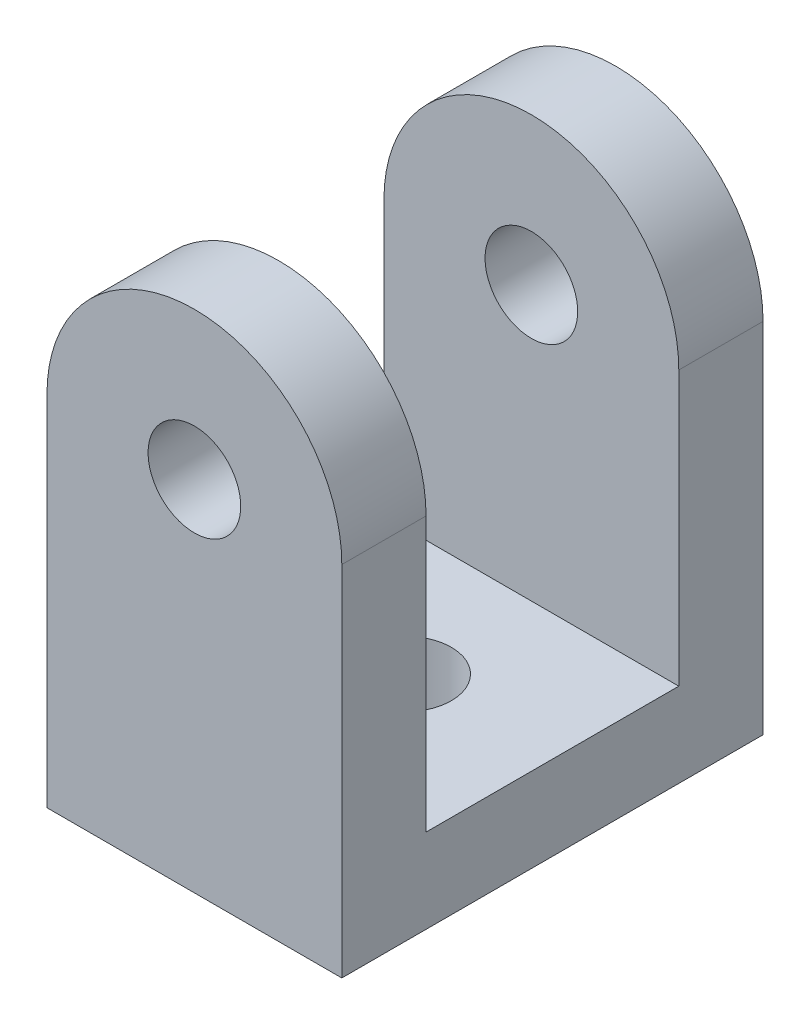
ISO-10303-21;
HEADER;
FILE_DESCRIPTION(('STEP AP214'),'2;1');
FILE_NAME('part.step','',(''),(''),'','','');
FILE_SCHEMA(('AUTOMOTIVE_DESIGN { 1 0 10303 214 1 1 1 1 }'));
ENDSEC;
DATA;
#1=APPLICATION_CONTEXT('core data for automotive mechanical design processes');
#2=APPLICATION_PROTOCOL_DEFINITION('international standard','automotive_design',2000,#1);
#3=PRODUCT_CONTEXT('',#1,'mechanical');
#4=PRODUCT('Part','Part','',(#3));
#5=PRODUCT_RELATED_PRODUCT_CATEGORY('part','',(#4));
#6=PRODUCT_DEFINITION_FORMATION('','',#4);
#7=PRODUCT_DEFINITION_CONTEXT('part definition',#1,'design');
#8=PRODUCT_DEFINITION('design','',#6,#7);
#9=PRODUCT_DEFINITION_SHAPE('','',#8);
#10=(LENGTH_UNIT() NAMED_UNIT(*) SI_UNIT(.MILLI.,.METRE.));
#11=(NAMED_UNIT(*) PLANE_ANGLE_UNIT() SI_UNIT($,.RADIAN.));
#12=(NAMED_UNIT(*) SI_UNIT($,.STERADIAN.) SOLID_ANGLE_UNIT());
#13=UNCERTAINTY_MEASURE_WITH_UNIT(LENGTH_MEASURE(1.E-05),#10,'distance_accuracy_value','');
#14=(GEOMETRIC_REPRESENTATION_CONTEXT(3) GLOBAL_UNCERTAINTY_ASSIGNED_CONTEXT((#13)) GLOBAL_UNIT_ASSIGNED_CONTEXT((#10,
#11,#12)) REPRESENTATION_CONTEXT('',''));
#15=CARTESIAN_POINT('',(0.,0.,0.));
#16=DIRECTION('',(0.,0.,1.));
#17=DIRECTION('',(1.,0.,0.));
#18=AXIS2_PLACEMENT_3D('',#15,#16,#17);
#19=CARTESIAN_POINT('',(0.,8.5,-5.));
#20=DIRECTION('',(0.,0.,-1.));
#21=DIRECTION('',(-1.,0.,0.));
#22=AXIS2_PLACEMENT_3D('',#19,#20,#21);
#23=CYLINDRICAL_SURFACE('',#22,3.5);
#24=DIRECTION('',(0.,0.,-1.));
#25=VECTOR('',#24,1.);
#26=CARTESIAN_POINT('',(3.5,8.5,-5.));
#27=LINE('',#26,#25);
#28=CARTESIAN_POINT('',(3.5,8.5,-5.));
#29=VERTEX_POINT('',#28);
#30=CARTESIAN_POINT('',(3.5,8.5,-3.));
#31=VERTEX_POINT('',#30);
#32=EDGE_CURVE('E163',#29,#31,#27,.F.);
#33=ORIENTED_EDGE('',*,*,#32,.F.);
#34=CARTESIAN_POINT('',(0.,8.5,-5.));
#35=DIRECTION('',(0.,0.,1.));
#36=DIRECTION('',(1.,0.,0.));
#37=AXIS2_PLACEMENT_3D('',#34,#35,#36);
#38=CIRCLE('',#37,3.5);
#39=CARTESIAN_POINT('',(-3.5,8.5,-5.));
#40=VERTEX_POINT('',#39);
#41=EDGE_CURVE('E46',#40,#29,#38,.F.);
#42=ORIENTED_EDGE('',*,*,#41,.F.);
#43=DIRECTION('',(0.,0.,-1.));
#44=VECTOR('',#43,1.);
#45=CARTESIAN_POINT('',(-3.5,8.5,-5.));
#46=LINE('',#45,#44);
#47=CARTESIAN_POINT('',(-3.5,8.5,-3.));
#48=VERTEX_POINT('',#47);
#49=EDGE_CURVE('E166',#48,#40,#46,.T.);
#50=ORIENTED_EDGE('',*,*,#49,.F.);
#51=CARTESIAN_POINT('',(0.,8.5,-3.));
#52=DIRECTION('',(0.,0.,-1.));
#53=DIRECTION('',(-1.,0.,0.));
#54=AXIS2_PLACEMENT_3D('',#51,#52,#53);
#55=CIRCLE('',#54,3.5);
#56=EDGE_CURVE('E11',#31,#48,#55,.F.);
#57=ORIENTED_EDGE('',*,*,#56,.F.);
#58=EDGE_LOOP('',(#33,#42,#50,#57));
#59=FACE_BOUND('',#58,.T.);
#60=ADVANCED_FACE('F37',(#59),#23,.T.);
#61=CARTESIAN_POINT('',(0.,8.5,3.));
#62=DIRECTION('',(0.,0.,-1.));
#63=DIRECTION('',(-1.,0.,0.));
#64=AXIS2_PLACEMENT_3D('',#61,#62,#63);
#65=CYLINDRICAL_SURFACE('',#64,3.5);
#66=DIRECTION('',(0.,0.,-1.));
#67=VECTOR('',#66,1.);
#68=CARTESIAN_POINT('',(3.5,8.5,-5.));
#69=LINE('',#68,#67);
#70=CARTESIAN_POINT('',(3.5,8.5,3.));
#71=VERTEX_POINT('',#70);
#72=CARTESIAN_POINT('',(3.5,8.5,5.));
#73=VERTEX_POINT('',#72);
#74=EDGE_CURVE('E155',#71,#73,#69,.F.);
#75=ORIENTED_EDGE('',*,*,#74,.F.);
#76=CARTESIAN_POINT('',(0.,8.5,3.));
#77=DIRECTION('',(0.,0.,1.));
#78=DIRECTION('',(1.,0.,0.));
#79=AXIS2_PLACEMENT_3D('',#76,#77,#78);
#80=CIRCLE('',#79,3.5);
#81=CARTESIAN_POINT('',(-3.5,8.5,3.));
#82=VERTEX_POINT('',#81);
#83=EDGE_CURVE('E159',#82,#71,#80,.F.);
#84=ORIENTED_EDGE('',*,*,#83,.F.);
#85=DIRECTION('',(0.,0.,-1.));
#86=VECTOR('',#85,1.);
#87=CARTESIAN_POINT('',(-3.5,8.5,-5.));
#88=LINE('',#87,#86);
#89=CARTESIAN_POINT('',(-3.5,8.5,5.));
#90=VERTEX_POINT('',#89);
#91=EDGE_CURVE('E109',#90,#82,#88,.T.);
#92=ORIENTED_EDGE('',*,*,#91,.F.);
#93=CARTESIAN_POINT('',(0.,8.5,5.));
#94=DIRECTION('',(0.,0.,-1.));
#95=DIRECTION('',(-1.,0.,0.));
#96=AXIS2_PLACEMENT_3D('',#93,#94,#95);
#97=CIRCLE('',#96,3.5);
#98=EDGE_CURVE('E161',#73,#90,#97,.F.);
#99=ORIENTED_EDGE('',*,*,#98,.F.);
#100=EDGE_LOOP('',(#75,#84,#92,#99));
#101=FACE_BOUND('',#100,.T.);
#102=ADVANCED_FACE('F205',(#101),#65,.T.);
#103=CARTESIAN_POINT('',(0.,2.,0.));
#104=DIRECTION('',(0.,1.,0.));
#105=DIRECTION('',(0.,0.,1.));
#106=AXIS2_PLACEMENT_3D('',#103,#104,#105);
#107=PLANE('',#106);
#108=CARTESIAN_POINT('',(0.,2.,0.));
#109=DIRECTION('',(0.,1.,0.));
#110=DIRECTION('',(0.,0.,1.));
#111=AXIS2_PLACEMENT_3D('',#108,#109,#110);
#112=CIRCLE('',#111,1.1);
#113=CARTESIAN_POINT('',(0.,2.,1.1));
#114=VERTEX_POINT('',#113);
#115=EDGE_CURVE('E182',#114,#114,#112,.T.);
#116=ORIENTED_EDGE('',*,*,#115,.F.);
#117=EDGE_LOOP('',(#116));
#118=FACE_BOUND('',#117,.T.);
#119=DIRECTION('',(0.,0.,-1.));
#120=VECTOR('',#119,1.);
#121=CARTESIAN_POINT('',(3.5,2.,-5.));
#122=LINE('',#121,#120);
#123=CARTESIAN_POINT('',(3.5,2.,3.));
#124=VERTEX_POINT('',#123);
#125=CARTESIAN_POINT('',(3.5,2.,-3.));
#126=VERTEX_POINT('',#125);
#127=EDGE_CURVE('E124',#124,#126,#122,.T.);
#128=ORIENTED_EDGE('',*,*,#127,.T.);
#129=DIRECTION('',(1.,0.,0.));
#130=VECTOR('',#129,1.);
#131=CARTESIAN_POINT('',(-3.5,2.,-3.));
#132=LINE('',#131,#130);
#133=CARTESIAN_POINT('',(-3.5,2.,-3.));
#134=VERTEX_POINT('',#133);
#135=EDGE_CURVE('E122',#134,#126,#132,.T.);
#136=ORIENTED_EDGE('',*,*,#135,.F.);
#137=DIRECTION('',(0.,0.,1.));
#138=VECTOR('',#137,1.);
#139=CARTESIAN_POINT('',(-3.5,2.,-5.));
#140=LINE('',#139,#138);
#141=CARTESIAN_POINT('',(-3.5,2.,3.));
#142=VERTEX_POINT('',#141);
#143=EDGE_CURVE('E106',#134,#142,#140,.T.);
#144=ORIENTED_EDGE('',*,*,#143,.T.);
#145=DIRECTION('',(-1.,0.,0.));
#146=VECTOR('',#145,1.);
#147=CARTESIAN_POINT('',(-3.5,2.,3.));
#148=LINE('',#147,#146);
#149=EDGE_CURVE('E113',#124,#142,#148,.T.);
#150=ORIENTED_EDGE('',*,*,#149,.F.);
#151=EDGE_LOOP('',(#128,#136,#144,#150));
#152=FACE_BOUND('',#151,.T.);
#153=ADVANCED_FACE('F119',(#118,#152),#107,.T.);
#154=CARTESIAN_POINT('',(3.5,2.,-5.));
#155=DIRECTION('',(-1.,0.,0.));
#156=DIRECTION('',(0.,0.,1.));
#157=AXIS2_PLACEMENT_3D('',#154,#155,#156);
#158=PLANE('',#157);
#159=DIRECTION('',(0.,-1.,0.));
#160=VECTOR('',#159,1.);
#161=CARTESIAN_POINT('',(3.5,2.,-5.));
#162=LINE('',#161,#160);
#163=CARTESIAN_POINT('',(3.5,0.,-5.));
#164=VERTEX_POINT('',#163);
#165=EDGE_CURVE('E153',#29,#164,#162,.T.);
#166=ORIENTED_EDGE('',*,*,#165,.F.);
#167=ORIENTED_EDGE('',*,*,#32,.T.);
#168=DIRECTION('',(0.,-1.,0.));
#169=VECTOR('',#168,1.);
#170=CARTESIAN_POINT('',(3.5,12.,-3.));
#171=LINE('',#170,#169);
#172=EDGE_CURVE('E130',#31,#126,#171,.T.);
#173=ORIENTED_EDGE('',*,*,#172,.T.);
#174=ORIENTED_EDGE('',*,*,#127,.F.);
#175=DIRECTION('',(0.,-1.,0.));
#176=VECTOR('',#175,1.);
#177=CARTESIAN_POINT('',(3.5,12.,3.));
#178=LINE('',#177,#176);
#179=EDGE_CURVE('E112',#71,#124,#178,.T.);
#180=ORIENTED_EDGE('',*,*,#179,.F.);
#181=ORIENTED_EDGE('',*,*,#74,.T.);
#182=DIRECTION('',(0.,-1.,0.));
#183=VECTOR('',#182,1.);
#184=CARTESIAN_POINT('',(3.5,2.,5.));
#185=LINE('',#184,#183);
#186=CARTESIAN_POINT('',(3.5,0.,5.));
#187=VERTEX_POINT('',#186);
#188=EDGE_CURVE('E123',#73,#187,#185,.T.);
#189=ORIENTED_EDGE('',*,*,#188,.T.);
#190=DIRECTION('',(0.,0.,-1.));
#191=VECTOR('',#190,1.);
#192=CARTESIAN_POINT('',(3.5,0.,-5.));
#193=LINE('',#192,#191);
#194=EDGE_CURVE('E135',#187,#164,#193,.T.);
#195=ORIENTED_EDGE('',*,*,#194,.T.);
#196=EDGE_LOOP('',(#166,#167,#173,#174,#180,#181,#189,#195));
#197=FACE_BOUND('',#196,.T.);
#198=ADVANCED_FACE('F189',(#197),#158,.F.);
#199=CARTESIAN_POINT('',(-3.5,2.,-5.));
#200=DIRECTION('',(0.,0.,1.));
#201=DIRECTION('',(1.,0.,0.));
#202=AXIS2_PLACEMENT_3D('',#199,#200,#201);
#203=PLANE('',#202);
#204=CARTESIAN_POINT('',(0.,8.5,-5.));
#205=DIRECTION('',(0.,0.,-1.));
#206=DIRECTION('',(-1.,0.,0.));
#207=AXIS2_PLACEMENT_3D('',#204,#205,#206);
#208=CIRCLE('',#207,1.1);
#209=CARTESIAN_POINT('',(-1.1,8.5,-5.));
#210=VERTEX_POINT('',#209);
#211=EDGE_CURVE('E171',#210,#210,#208,.T.);
#212=ORIENTED_EDGE('',*,*,#211,.F.);
#213=EDGE_LOOP('',(#212));
#214=FACE_BOUND('',#213,.T.);
#215=DIRECTION('',(0.,-1.,0.));
#216=VECTOR('',#215,1.);
#217=CARTESIAN_POINT('',(-3.5,2.,-5.));
#218=LINE('',#217,#216);
#219=CARTESIAN_POINT('',(-3.5,0.,-5.));
#220=VERTEX_POINT('',#219);
#221=EDGE_CURVE('E151',#40,#220,#218,.T.);
#222=ORIENTED_EDGE('',*,*,#221,.F.);
#223=ORIENTED_EDGE('',*,*,#41,.T.);
#224=ORIENTED_EDGE('',*,*,#165,.T.);
#225=DIRECTION('',(-1.,0.,0.));
#226=VECTOR('',#225,1.);
#227=CARTESIAN_POINT('',(-3.5,0.,-5.));
#228=LINE('',#227,#226);
#229=EDGE_CURVE('E140',#164,#220,#228,.T.);
#230=ORIENTED_EDGE('',*,*,#229,.T.);
#231=EDGE_LOOP('',(#222,#223,#224,#230));
#232=FACE_BOUND('',#231,.T.);
#233=ADVANCED_FACE('F193',(#214,#232),#203,.F.);
#234=CARTESIAN_POINT('',(-3.5,2.,-5.));
#235=DIRECTION('',(1.,0.,0.));
#236=DIRECTION('',(0.,0.,-1.));
#237=AXIS2_PLACEMENT_3D('',#234,#235,#236);
#238=PLANE('',#237);
#239=DIRECTION('',(0.,-1.,0.));
#240=VECTOR('',#239,1.);
#241=CARTESIAN_POINT('',(-3.5,12.,-3.));
#242=LINE('',#241,#240);
#243=EDGE_CURVE('E128',#48,#134,#242,.T.);
#244=ORIENTED_EDGE('',*,*,#243,.F.);
#245=ORIENTED_EDGE('',*,*,#49,.T.);
#246=ORIENTED_EDGE('',*,*,#221,.T.);
#247=DIRECTION('',(0.,0.,1.));
#248=VECTOR('',#247,1.);
#249=CARTESIAN_POINT('',(-3.5,0.,-5.));
#250=LINE('',#249,#248);
#251=CARTESIAN_POINT('',(-3.5,0.,5.));
#252=VERTEX_POINT('',#251);
#253=EDGE_CURVE('E143',#220,#252,#250,.T.);
#254=ORIENTED_EDGE('',*,*,#253,.T.);
#255=DIRECTION('',(0.,-1.,0.));
#256=VECTOR('',#255,1.);
#257=CARTESIAN_POINT('',(-3.5,2.,5.));
#258=LINE('',#257,#256);
#259=EDGE_CURVE('E149',#90,#252,#258,.T.);
#260=ORIENTED_EDGE('',*,*,#259,.F.);
#261=ORIENTED_EDGE('',*,*,#91,.T.);
#262=DIRECTION('',(0.,-1.,0.));
#263=VECTOR('',#262,1.);
#264=CARTESIAN_POINT('',(-3.5,12.,3.));
#265=LINE('',#264,#263);
#266=EDGE_CURVE('E102',#82,#142,#265,.T.);
#267=ORIENTED_EDGE('',*,*,#266,.T.);
#268=ORIENTED_EDGE('',*,*,#143,.F.);
#269=EDGE_LOOP('',(#244,#245,#246,#254,#260,#261,#267,#268));
#270=FACE_BOUND('',#269,.T.);
#271=ADVANCED_FACE('F105',(#270),#238,.F.);
#272=CARTESIAN_POINT('',(-3.5,2.,5.));
#273=DIRECTION('',(0.,0.,-1.));
#274=DIRECTION('',(-1.,0.,0.));
#275=AXIS2_PLACEMENT_3D('',#272,#273,#274);
#276=PLANE('',#275);
#277=CARTESIAN_POINT('',(0.,8.5,5.));
#278=DIRECTION('',(0.,0.,-1.));
#279=DIRECTION('',(-1.,0.,0.));
#280=AXIS2_PLACEMENT_3D('',#277,#278,#279);
#281=CIRCLE('',#280,1.1);
#282=CARTESIAN_POINT('',(-1.1,8.5,5.));
#283=VERTEX_POINT('',#282);
#284=EDGE_CURVE('E175',#283,#283,#281,.T.);
#285=ORIENTED_EDGE('',*,*,#284,.T.);
#286=EDGE_LOOP('',(#285));
#287=FACE_BOUND('',#286,.T.);
#288=ORIENTED_EDGE('',*,*,#188,.F.);
#289=ORIENTED_EDGE('',*,*,#98,.T.);
#290=ORIENTED_EDGE('',*,*,#259,.T.);
#291=DIRECTION('',(1.,0.,0.));
#292=VECTOR('',#291,1.);
#293=CARTESIAN_POINT('',(-3.5,0.,5.));
#294=LINE('',#293,#292);
#295=EDGE_CURVE('E136',#252,#187,#294,.T.);
#296=ORIENTED_EDGE('',*,*,#295,.T.);
#297=EDGE_LOOP('',(#288,#289,#290,#296));
#298=FACE_BOUND('',#297,.T.);
#299=ADVANCED_FACE('F202',(#287,#298),#276,.F.);
#300=CARTESIAN_POINT('',(0.,0.,0.));
#301=DIRECTION('',(0.,1.,0.));
#302=DIRECTION('',(0.,0.,1.));
#303=AXIS2_PLACEMENT_3D('',#300,#301,#302);
#304=PLANE('',#303);
#305=CARTESIAN_POINT('',(0.,0.,0.));
#306=DIRECTION('',(0.,1.,0.));
#307=DIRECTION('',(0.,0.,1.));
#308=AXIS2_PLACEMENT_3D('',#305,#306,#307);
#309=CIRCLE('',#308,1.1);
#310=CARTESIAN_POINT('',(0.,0.,1.1));
#311=VERTEX_POINT('',#310);
#312=EDGE_CURVE('E41',#311,#311,#309,.T.);
#313=ORIENTED_EDGE('',*,*,#312,.T.);
#314=EDGE_LOOP('',(#313));
#315=FACE_BOUND('',#314,.T.);
#316=ORIENTED_EDGE('',*,*,#194,.F.);
#317=ORIENTED_EDGE('',*,*,#295,.F.);
#318=ORIENTED_EDGE('',*,*,#253,.F.);
#319=ORIENTED_EDGE('',*,*,#229,.F.);
#320=EDGE_LOOP('',(#316,#317,#318,#319));
#321=FACE_BOUND('',#320,.T.);
#322=ADVANCED_FACE('F199',(#315,#321),#304,.F.);
#323=CARTESIAN_POINT('',(-3.5,12.,3.));
#324=DIRECTION('',(0.,0.,1.));
#325=DIRECTION('',(1.,0.,0.));
#326=AXIS2_PLACEMENT_3D('',#323,#324,#325);
#327=PLANE('',#326);
#328=CARTESIAN_POINT('',(0.,8.5,3.));
#329=DIRECTION('',(0.,0.,1.));
#330=DIRECTION('',(1.,0.,0.));
#331=AXIS2_PLACEMENT_3D('',#328,#329,#330);
#332=CIRCLE('',#331,1.1);
#333=CARTESIAN_POINT('',(1.1,8.5,3.));
#334=VERTEX_POINT('',#333);
#335=EDGE_CURVE('E170',#334,#334,#332,.T.);
#336=ORIENTED_EDGE('',*,*,#335,.T.);
#337=EDGE_LOOP('',(#336));
#338=FACE_BOUND('',#337,.T.);
#339=ORIENTED_EDGE('',*,*,#266,.F.);
#340=ORIENTED_EDGE('',*,*,#83,.T.);
#341=ORIENTED_EDGE('',*,*,#179,.T.);
#342=ORIENTED_EDGE('',*,*,#149,.T.);
#343=EDGE_LOOP('',(#339,#340,#341,#342));
#344=FACE_BOUND('',#343,.T.);
#345=ADVANCED_FACE('F126',(#338,#344),#327,.F.);
#346=CARTESIAN_POINT('',(-3.5,12.,-3.));
#347=DIRECTION('',(0.,0.,-1.));
#348=DIRECTION('',(-1.,0.,0.));
#349=AXIS2_PLACEMENT_3D('',#346,#347,#348);
#350=PLANE('',#349);
#351=CARTESIAN_POINT('',(0.,8.5,-3.));
#352=DIRECTION('',(0.,0.,-1.));
#353=DIRECTION('',(-1.,0.,0.));
#354=AXIS2_PLACEMENT_3D('',#351,#352,#353);
#355=CIRCLE('',#354,1.1);
#356=CARTESIAN_POINT('',(-1.1,8.5,-3.));
#357=VERTEX_POINT('',#356);
#358=EDGE_CURVE('E168',#357,#357,#355,.T.);
#359=ORIENTED_EDGE('',*,*,#358,.T.);
#360=EDGE_LOOP('',(#359));
#361=FACE_BOUND('',#360,.T.);
#362=ORIENTED_EDGE('',*,*,#172,.F.);
#363=ORIENTED_EDGE('',*,*,#56,.T.);
#364=ORIENTED_EDGE('',*,*,#243,.T.);
#365=ORIENTED_EDGE('',*,*,#135,.T.);
#366=EDGE_LOOP('',(#362,#363,#364,#365));
#367=FACE_BOUND('',#366,.T.);
#368=ADVANCED_FACE('F190',(#361,#367),#350,.F.);
#369=CARTESIAN_POINT('',(0.,8.5,20.));
#370=DIRECTION('',(0.,0.,-1.));
#371=DIRECTION('',(-1.,0.,0.));
#372=AXIS2_PLACEMENT_3D('',#369,#370,#371);
#373=CYLINDRICAL_SURFACE('',#372,1.1);
#374=ORIENTED_EDGE('',*,*,#211,.T.);
#375=EDGE_LOOP('',(#374));
#376=FACE_BOUND('',#375,.T.);
#377=ORIENTED_EDGE('',*,*,#358,.F.);
#378=EDGE_LOOP('',(#377));
#379=FACE_BOUND('',#378,.T.);
#380=ADVANCED_FACE('F235',(#376,#379),#373,.F.);
#381=ORIENTED_EDGE('',*,*,#335,.F.);
#382=EDGE_LOOP('',(#381));
#383=FACE_BOUND('',#382,.T.);
#384=ORIENTED_EDGE('',*,*,#284,.F.);
#385=EDGE_LOOP('',(#384));
#386=FACE_BOUND('',#385,.T.);
#387=ADVANCED_FACE('F236',(#383,#386),#373,.F.);
#388=CARTESIAN_POINT('',(0.,-23.,0.));
#389=DIRECTION('',(0.,1.,0.));
#390=DIRECTION('',(0.,0.,1.));
#391=AXIS2_PLACEMENT_3D('',#388,#389,#390);
#392=CYLINDRICAL_SURFACE('',#391,1.1);
#393=ORIENTED_EDGE('',*,*,#115,.T.);
#394=EDGE_LOOP('',(#393));
#395=FACE_BOUND('',#394,.T.);
#396=ORIENTED_EDGE('',*,*,#312,.F.);
#397=EDGE_LOOP('',(#396));
#398=FACE_BOUND('',#397,.T.);
#399=ADVANCED_FACE('F239',(#395,#398),#392,.F.);
#400=CLOSED_SHELL('',(#60,#102,#153,#198,#233,#271,#299,#322,#345,#368,#380,#387,#399));
#401=MANIFOLD_SOLID_BREP('B2',#400);
#402=ADVANCED_BREP_SHAPE_REPRESENTATION('',(#18,#401),#14);
#403=SHAPE_DEFINITION_REPRESENTATION(#9,#402);
ENDSEC;
END-ISO-10303-21;
